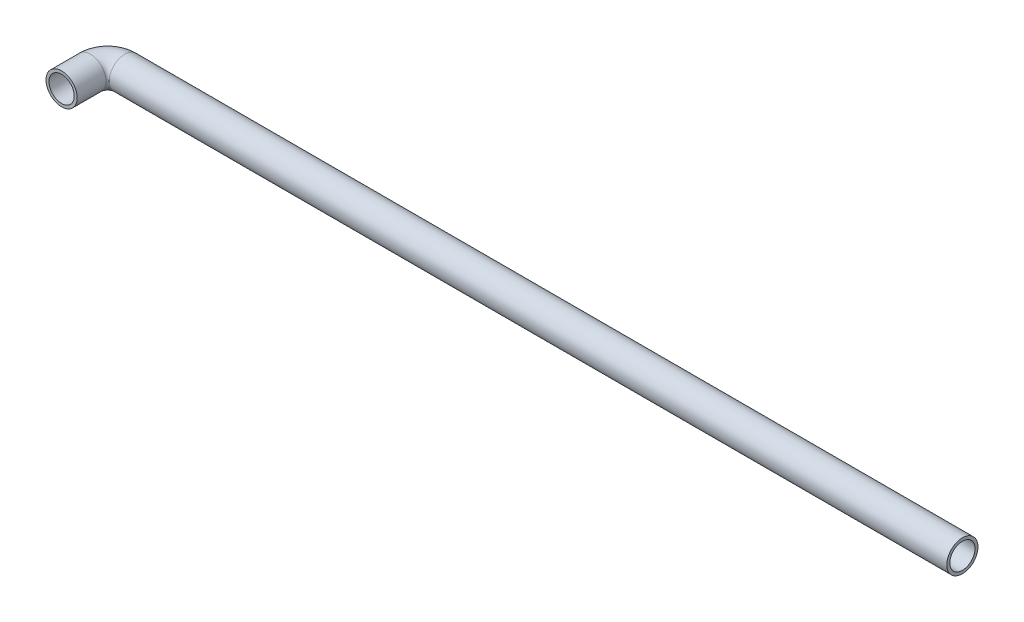
ISO-10303-21;
HEADER;
FILE_DESCRIPTION(('STEP AP214'),'2;1');
FILE_NAME('part.step','',(''),(''),'','','');
FILE_SCHEMA(('AUTOMOTIVE_DESIGN { 1 0 10303 214 1 1 1 1 }'));
ENDSEC;
DATA;
#1=APPLICATION_CONTEXT('core data for automotive mechanical design processes');
#2=APPLICATION_PROTOCOL_DEFINITION('international standard','automotive_design',2000,#1);
#3=PRODUCT_CONTEXT('',#1,'mechanical');
#4=PRODUCT('Part','Part','',(#3));
#5=PRODUCT_RELATED_PRODUCT_CATEGORY('part','',(#4));
#6=PRODUCT_DEFINITION_FORMATION('','',#4);
#7=PRODUCT_DEFINITION_CONTEXT('part definition',#1,'design');
#8=PRODUCT_DEFINITION('design','',#6,#7);
#9=PRODUCT_DEFINITION_SHAPE('','',#8);
#10=(LENGTH_UNIT() NAMED_UNIT(*) SI_UNIT(.MILLI.,.METRE.));
#11=(NAMED_UNIT(*) PLANE_ANGLE_UNIT() SI_UNIT($,.RADIAN.));
#12=(NAMED_UNIT(*) SI_UNIT($,.STERADIAN.) SOLID_ANGLE_UNIT());
#13=UNCERTAINTY_MEASURE_WITH_UNIT(LENGTH_MEASURE(1.E-05),#10,'distance_accuracy_value','');
#14=(GEOMETRIC_REPRESENTATION_CONTEXT(3) GLOBAL_UNCERTAINTY_ASSIGNED_CONTEXT((#13)) GLOBAL_UNIT_ASSIGNED_CONTEXT((#10,
#11,#12)) REPRESENTATION_CONTEXT('',''));
#15=CARTESIAN_POINT('',(0.,0.,0.));
#16=DIRECTION('',(0.,0.,1.));
#17=DIRECTION('',(1.,0.,0.));
#18=AXIS2_PLACEMENT_3D('',#15,#16,#17);
#19=CARTESIAN_POINT('',(0.,0.,0.));
#20=DIRECTION('',(0.,0.,-1.));
#21=DIRECTION('',(-1.,0.,0.));
#22=AXIS2_PLACEMENT_3D('',#19,#20,#21);
#23=CYLINDRICAL_SURFACE('',#22,6.858);
#24=CARTESIAN_POINT('',(0.,0.,-12.7));
#25=DIRECTION('',(0.,0.,1.));
#26=DIRECTION('',(1.,0.,0.));
#27=AXIS2_PLACEMENT_3D('',#24,#25,#26);
#28=CIRCLE('',#27,6.858);
#29=CARTESIAN_POINT('',(-6.858,0.,-12.7));
#30=VERTEX_POINT('',#29);
#31=EDGE_CURVE('E64',#30,#30,#28,.T.);
#32=ORIENTED_EDGE('',*,*,#31,.T.);
#33=EDGE_LOOP('',(#32));
#34=FACE_BOUND('',#33,.T.);
#35=CARTESIAN_POINT('',(0.,0.,0.));
#36=DIRECTION('',(0.,0.,1.));
#37=DIRECTION('',(1.,0.,0.));
#38=AXIS2_PLACEMENT_3D('',#35,#36,#37);
#39=CIRCLE('',#38,6.858);
#40=CARTESIAN_POINT('',(6.858,0.,0.));
#41=VERTEX_POINT('',#40);
#42=EDGE_CURVE('E61',#41,#41,#39,.T.);
#43=ORIENTED_EDGE('',*,*,#42,.F.);
#44=EDGE_LOOP('',(#43));
#45=FACE_BOUND('',#44,.T.);
#46=ADVANCED_FACE('F37',(#34,#45),#23,.T.);
#47=CARTESIAN_POINT('',(7.54083055259487,0.,-12.7));
#48=DIRECTION('',(0.,-1.,0.));
#49=DIRECTION('',(0.,0.,-1.));
#50=AXIS2_PLACEMENT_3D('',#47,#48,#49);
#51=TOROIDAL_SURFACE('',#50,7.54083055259487,6.858);
#52=CARTESIAN_POINT('',(7.54083055259487,0.,-20.2408305525949));
#53=DIRECTION('',(-1.,0.,0.));
#54=DIRECTION('',(0.,0.,1.));
#55=AXIS2_PLACEMENT_3D('',#52,#53,#54);
#56=CIRCLE('',#55,6.858);
#57=CARTESIAN_POINT('',(7.54083055259487,0.,-27.0988305525949));
#58=VERTEX_POINT('',#57);
#59=EDGE_CURVE('E41',#58,#58,#56,.T.);
#60=CARTESIAN_POINT('',(7.54083055259487,0.,-12.7));
#61=DIRECTION('',(0.,-1.,0.));
#62=DIRECTION('',(0.,0.,-1.));
#63=AXIS2_PLACEMENT_3D('',#60,#61,#62);
#64=CIRCLE('',#63,14.3988305525949);
#65=EDGE_CURVE('',#30,#58,#64,.T.);
#66=ORIENTED_EDGE('',*,*,#31,.F.);
#67=ORIENTED_EDGE('',*,*,#59,.T.);
#68=ORIENTED_EDGE('',*,*,#65,.T.);
#69=ORIENTED_EDGE('',*,*,#65,.F.);
#70=EDGE_LOOP('',(#66,#68,#67,#69));
#71=FACE_BOUND('',#70,.T.);
#72=ADVANCED_FACE('F73',(#71),#51,.T.);
#73=CARTESIAN_POINT('',(7.54083055259487,0.,-20.2408305525949));
#74=DIRECTION('',(1.,0.,0.));
#75=DIRECTION('',(0.,0.,-1.));
#76=AXIS2_PLACEMENT_3D('',#73,#74,#75);
#77=CYLINDRICAL_SURFACE('',#76,6.858);
#78=CARTESIAN_POINT('',(375.840830552595,0.,-20.2408305525949));
#79=DIRECTION('',(-1.,0.,0.));
#80=DIRECTION('',(0.,0.,1.));
#81=AXIS2_PLACEMENT_3D('',#78,#79,#80);
#82=CIRCLE('',#81,6.858);
#83=CARTESIAN_POINT('',(375.840830552595,0.,-13.3828305525949));
#84=VERTEX_POINT('',#83);
#85=EDGE_CURVE('E56',#84,#84,#82,.T.);
#86=ORIENTED_EDGE('',*,*,#85,.T.);
#87=EDGE_LOOP('',(#86));
#88=FACE_BOUND('',#87,.T.);
#89=ORIENTED_EDGE('',*,*,#59,.F.);
#90=EDGE_LOOP('',(#89));
#91=FACE_BOUND('',#90,.T.);
#92=ADVANCED_FACE('F39',(#88,#91),#77,.T.);
#93=CARTESIAN_POINT('',(0.,0.,0.));
#94=DIRECTION('',(0.,0.,1.));
#95=DIRECTION('',(1.,0.,0.));
#96=AXIS2_PLACEMENT_3D('',#93,#94,#95);
#97=PLANE('',#96);
#98=CARTESIAN_POINT('',(0.,0.,0.));
#99=DIRECTION('',(0.,0.,1.));
#100=DIRECTION('',(1.,0.,0.));
#101=AXIS2_PLACEMENT_3D('',#98,#99,#100);
#102=CIRCLE('',#101,5.55625);
#103=CARTESIAN_POINT('',(5.55625,0.,0.));
#104=VERTEX_POINT('',#103);
#105=EDGE_CURVE('E60',#104,#104,#102,.F.);
#106=ORIENTED_EDGE('',*,*,#105,.T.);
#107=EDGE_LOOP('',(#106));
#108=FACE_BOUND('',#107,.T.);
#109=ORIENTED_EDGE('',*,*,#42,.T.);
#110=EDGE_LOOP('',(#109));
#111=FACE_BOUND('',#110,.T.);
#112=ADVANCED_FACE('F77',(#108,#111),#97,.T.);
#113=CARTESIAN_POINT('',(375.840830552595,0.,-20.2408305525949));
#114=DIRECTION('',(-1.,0.,0.));
#115=DIRECTION('',(0.,0.,1.));
#116=AXIS2_PLACEMENT_3D('',#113,#114,#115);
#117=PLANE('',#116);
#118=CARTESIAN_POINT('',(375.840830552595,0.,-20.2408305525949));
#119=DIRECTION('',(-1.,0.,0.));
#120=DIRECTION('',(0.,0.,1.));
#121=AXIS2_PLACEMENT_3D('',#118,#119,#120);
#122=CIRCLE('',#121,5.55625);
#123=CARTESIAN_POINT('',(375.840830552595,0.,-14.6845805525949));
#124=VERTEX_POINT('',#123);
#125=EDGE_CURVE('E10',#124,#124,#122,.F.);
#126=ORIENTED_EDGE('',*,*,#125,.F.);
#127=EDGE_LOOP('',(#126));
#128=FACE_BOUND('',#127,.T.);
#129=ORIENTED_EDGE('',*,*,#85,.F.);
#130=EDGE_LOOP('',(#129));
#131=FACE_BOUND('',#130,.T.);
#132=ADVANCED_FACE('F83',(#128,#131),#117,.F.);
#133=CARTESIAN_POINT('',(0.,0.,0.));
#134=DIRECTION('',(0.,0.,-1.));
#135=DIRECTION('',(-1.,0.,0.));
#136=AXIS2_PLACEMENT_3D('',#133,#134,#135);
#137=CYLINDRICAL_SURFACE('',#136,5.55625);
#138=CARTESIAN_POINT('',(0.,0.,-12.7));
#139=DIRECTION('',(0.,0.,1.));
#140=DIRECTION('',(1.,0.,0.));
#141=AXIS2_PLACEMENT_3D('',#138,#139,#140);
#142=CIRCLE('',#141,5.55625);
#143=CARTESIAN_POINT('',(-5.55625,0.,-12.7));
#144=VERTEX_POINT('',#143);
#145=EDGE_CURVE('E52',#144,#144,#142,.F.);
#146=ORIENTED_EDGE('',*,*,#145,.T.);
#147=EDGE_LOOP('',(#146));
#148=FACE_BOUND('',#147,.T.);
#149=ORIENTED_EDGE('',*,*,#105,.F.);
#150=EDGE_LOOP('',(#149));
#151=FACE_BOUND('',#150,.T.);
#152=ADVANCED_FACE('F93',(#148,#151),#137,.F.);
#153=CARTESIAN_POINT('',(7.54083055259487,0.,-12.7));
#154=DIRECTION('',(0.,-1.,0.));
#155=DIRECTION('',(0.,0.,-1.));
#156=AXIS2_PLACEMENT_3D('',#153,#154,#155);
#157=TOROIDAL_SURFACE('',#156,7.54083055259487,5.55625);
#158=CARTESIAN_POINT('',(7.54083055259487,0.,-20.2408305525949));
#159=DIRECTION('',(-1.,0.,0.));
#160=DIRECTION('',(0.,0.,1.));
#161=AXIS2_PLACEMENT_3D('',#158,#159,#160);
#162=CIRCLE('',#161,5.55625);
#163=CARTESIAN_POINT('',(7.54083055259487,0.,-25.7970805525949));
#164=VERTEX_POINT('',#163);
#165=EDGE_CURVE('E46',#164,#164,#162,.F.);
#166=CARTESIAN_POINT('',(7.54083055259487,0.,-12.7));
#167=DIRECTION('',(0.,-1.,0.));
#168=DIRECTION('',(0.,0.,-1.));
#169=AXIS2_PLACEMENT_3D('',#166,#167,#168);
#170=CIRCLE('',#169,13.0970805525949);
#171=EDGE_CURVE('',#144,#164,#170,.T.);
#172=ORIENTED_EDGE('',*,*,#145,.F.);
#173=ORIENTED_EDGE('',*,*,#165,.T.);
#174=ORIENTED_EDGE('',*,*,#171,.T.);
#175=ORIENTED_EDGE('',*,*,#171,.F.);
#176=EDGE_LOOP('',(#172,#174,#173,#175));
#177=FACE_BOUND('',#176,.T.);
#178=ADVANCED_FACE('F88',(#177),#157,.F.);
#179=CARTESIAN_POINT('',(7.54083055259487,0.,-20.2408305525949));
#180=DIRECTION('',(1.,0.,0.));
#181=DIRECTION('',(0.,0.,-1.));
#182=AXIS2_PLACEMENT_3D('',#179,#180,#181);
#183=CYLINDRICAL_SURFACE('',#182,5.55625);
#184=ORIENTED_EDGE('',*,*,#125,.T.);
#185=EDGE_LOOP('',(#184));
#186=FACE_BOUND('',#185,.T.);
#187=ORIENTED_EDGE('',*,*,#165,.F.);
#188=EDGE_LOOP('',(#187));
#189=FACE_BOUND('',#188,.T.);
#190=ADVANCED_FACE('F86',(#186,#189),#183,.F.);
#191=CLOSED_SHELL('',(#46,#72,#92,#112,#132,#152,#178,#190));
#192=MANIFOLD_SOLID_BREP('B2',#191);
#193=ADVANCED_BREP_SHAPE_REPRESENTATION('',(#18,#192),#14);
#194=SHAPE_DEFINITION_REPRESENTATION(#9,#193);
ENDSEC;
END-ISO-10303-21;
